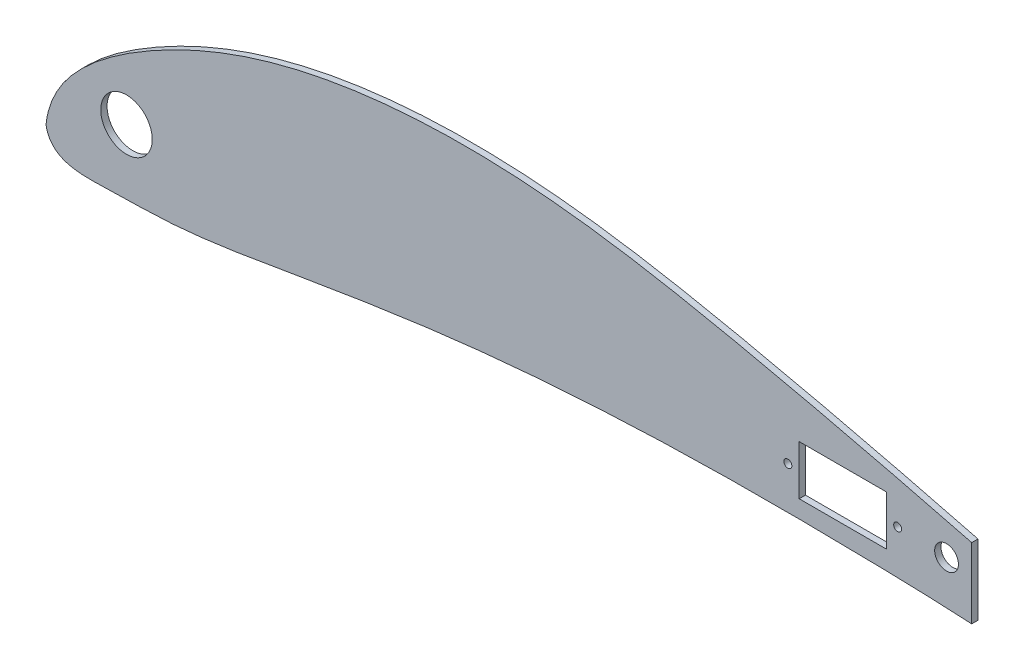
ISO-10303-21;
HEADER;
FILE_DESCRIPTION(('STEP AP214'),'2;1');
FILE_NAME('part.step','',(''),(''),'','','');
FILE_SCHEMA(('AUTOMOTIVE_DESIGN { 1 0 10303 214 1 1 1 1 }'));
ENDSEC;
DATA;
#1=APPLICATION_CONTEXT('core data for automotive mechanical design processes');
#2=APPLICATION_PROTOCOL_DEFINITION('international standard','automotive_design',2000,#1);
#3=PRODUCT_CONTEXT('',#1,'mechanical');
#4=PRODUCT('Part','Part','',(#3));
#5=PRODUCT_RELATED_PRODUCT_CATEGORY('part','',(#4));
#6=PRODUCT_DEFINITION_FORMATION('','',#4);
#7=PRODUCT_DEFINITION_CONTEXT('part definition',#1,'design');
#8=PRODUCT_DEFINITION('design','',#6,#7);
#9=PRODUCT_DEFINITION_SHAPE('','',#8);
#10=(LENGTH_UNIT() NAMED_UNIT(*) SI_UNIT(.MILLI.,.METRE.));
#11=(NAMED_UNIT(*) PLANE_ANGLE_UNIT() SI_UNIT($,.RADIAN.));
#12=(NAMED_UNIT(*) SI_UNIT($,.STERADIAN.) SOLID_ANGLE_UNIT());
#13=UNCERTAINTY_MEASURE_WITH_UNIT(LENGTH_MEASURE(1.E-05),#10,'distance_accuracy_value','');
#14=(GEOMETRIC_REPRESENTATION_CONTEXT(3) GLOBAL_UNCERTAINTY_ASSIGNED_CONTEXT((#13)) GLOBAL_UNIT_ASSIGNED_CONTEXT((#10,
#11,#12)) REPRESENTATION_CONTEXT('',''));
#15=CARTESIAN_POINT('',(0.,0.,0.));
#16=DIRECTION('',(0.,0.,1.));
#17=DIRECTION('',(1.,0.,0.));
#18=AXIS2_PLACEMENT_3D('',#15,#16,#17);
#19=CARTESIAN_POINT('',(0.000560351162113587,0.000130087070423624,1.5875));
#20=CARTESIAN_POINT('',(1.23071418869678,-6.92407609127206,1.5875));
#21=CARTESIAN_POINT('',(15.3166033306834,-6.18906584099094,1.5875));
#22=CARTESIAN_POINT('',(36.4546728163185,-6.09849990105009,1.5875));
#23=CARTESIAN_POINT('',(66.5061971849192,-0.586669106973501,1.5875));
#24=CARTESIAN_POINT('',(110.497331171581,6.18149522271792,1.5875));
#25=CARTESIAN_POINT('',(157.718638091679,9.03065014873911,1.5875));
#26=CARTESIAN_POINT('',(205.10142463584,8.83808028186313,1.5875));
#27=CARTESIAN_POINT('',(235.858814759408,7.87030619247826,1.5875));
#28=CARTESIAN_POINT('',(260.846344817159,5.42741339404395,1.5875));
#29=CARTESIAN_POINT('',(276.264022989737,4.51435670375389,1.5875));
#30=CARTESIAN_POINT('',(293.989507544058,2.09398731346533,1.5875));
#31=CARTESIAN_POINT('',(303.956832564589,1.47095520994628,1.5875));
#32=CARTESIAN_POINT('',(309.846313894505,0.000130087070423666,1.5875));
#33=B_SPLINE_CURVE_WITH_KNOTS('',3,(#19,#20,#21,#22,#23,#24,#25,#26,#27,#28,#29,#30,#31,#32),
.UNSPECIFIED.,.F.,.F.,(4,1,1,1,1,1,1,1,1,1,1,4),(0.,0.0569078595717698,0.106482711504673,
0.214488052979465,0.341297688349143,0.535095665520157,0.664680853556909,0.794660698192775,
0.828978881532905,0.904725108725214,0.942212919019968,1.),.UNSPECIFIED.);
#34=DIRECTION('',(0.,0.,-1.));
#35=VECTOR('',#34,1.);
#36=SURFACE_OF_LINEAR_EXTRUSION('',#33,#35);
#37=DIRECTION('',(0.,0.,-1.));
#38=VECTOR('',#37,1.);
#39=CARTESIAN_POINT('',(233.646313894505,7.69052977092525,1.5875));
#40=LINE('',#39,#38);
#41=CARTESIAN_POINT('',(233.646313894505,7.69052977146896,1.5875));
#42=VERTEX_POINT('',#41);
#43=CARTESIAN_POINT('',(233.646313884782,7.69052977146896,0.));
#44=VERTEX_POINT('',#43);
#45=EDGE_CURVE('E160',#42,#44,#40,.T.);
#46=ORIENTED_EDGE('',*,*,#45,.F.);
#47=CARTESIAN_POINT('',(0.000560351162116727,0.000130087070423829,1.5875));
#48=VERTEX_POINT('',#47);
#49=EDGE_CURVE('E179',#48,#42,#33,.T.);
#50=ORIENTED_EDGE('',*,*,#49,.F.);
#51=DIRECTION('',(0.,0.,-1.));
#52=VECTOR('',#51,1.);
#53=CARTESIAN_POINT('',(0.000560351162116727,0.000130087070423829,1.5875));
#54=LINE('',#53,#52);
#55=CARTESIAN_POINT('',(0.000560351162116727,0.000130087070423829,0.));
#56=VERTEX_POINT('',#55);
#57=EDGE_CURVE('E50',#48,#56,#54,.T.);
#58=ORIENTED_EDGE('',*,*,#57,.T.);
#59=CARTESIAN_POINT('',(0.000560351162113587,0.000130087070423624,0.));
#60=CARTESIAN_POINT('',(1.23071418869678,-6.92407609127206,0.));
#61=CARTESIAN_POINT('',(15.3166033306834,-6.18906584099094,0.));
#62=CARTESIAN_POINT('',(36.4546728163185,-6.09849990105009,0.));
#63=CARTESIAN_POINT('',(66.5061971849192,-0.586669106973501,0.));
#64=CARTESIAN_POINT('',(110.497331171581,6.18149522271792,0.));
#65=CARTESIAN_POINT('',(157.718638091679,9.03065014873911,0.));
#66=CARTESIAN_POINT('',(205.10142463584,8.83808028186313,0.));
#67=CARTESIAN_POINT('',(235.858814759408,7.87030619247826,0.));
#68=CARTESIAN_POINT('',(260.846344817159,5.42741339404395,0.));
#69=CARTESIAN_POINT('',(276.264022989737,4.51435670375389,0.));
#70=CARTESIAN_POINT('',(293.989507544058,2.09398731346533,0.));
#71=CARTESIAN_POINT('',(303.956832564589,1.47095520994628,0.));
#72=CARTESIAN_POINT('',(309.846313894505,0.000130087070423666,0.));
#73=B_SPLINE_CURVE_WITH_KNOTS('',3,(#59,#60,#61,#62,#63,#64,#65,#66,#67,#68,#69,#70,#71,#72),
.UNSPECIFIED.,.F.,.F.,(4,1,1,1,1,1,1,1,1,1,1,4),(0.,0.0569078595717698,0.106482711504673,
0.214488052979465,0.341297688349143,0.535095665520157,0.664680853556909,0.794660698192775,
0.828978881532905,0.904725108725214,0.942212919019968,1.),.UNSPECIFIED.);
#74=EDGE_CURVE('E168',#56,#44,#73,.T.);
#75=ORIENTED_EDGE('',*,*,#74,.T.);
#76=EDGE_LOOP('',(#46,#50,#58,#75));
#77=FACE_BOUND('',#76,.T.);
#78=ADVANCED_FACE('F41',(#77),#36,.F.);
#79=CARTESIAN_POINT('',(309.846313894505,0.000130087070423864,1.5875));
#80=CARTESIAN_POINT('',(314.816918223261,-0.51620674157964,1.5875));
#81=CARTESIAN_POINT('',(301.273197720551,4.38282813873556,1.5875));
#82=CARTESIAN_POINT('',(290.359837670022,8.71099439045776,1.5875));
#83=CARTESIAN_POINT('',(256.952064400645,19.5289209482833,1.5875));
#84=CARTESIAN_POINT('',(217.961060472083,29.6129748944238,1.5875));
#85=CARTESIAN_POINT('',(173.256699242147,40.0411042779434,1.5875));
#86=CARTESIAN_POINT('',(131.400792108858,47.8848319151037,1.5875));
#87=CARTESIAN_POINT('',(89.5976184754884,49.290763053775,1.5875));
#88=CARTESIAN_POINT('',(52.1111282710831,42.0692152748914,1.5875));
#89=CARTESIAN_POINT('',(26.2867198183782,29.9751763284633,1.5875));
#90=CARTESIAN_POINT('',(8.64909202481883,17.8566051741579,1.5875));
#91=CARTESIAN_POINT('',(0.810633126632263,7.35919605469637,1.5875));
#92=CARTESIAN_POINT('',(0.000560351162116727,0.000130087070423829,1.5875));
#93=B_SPLINE_CURVE_WITH_KNOTS('',3,(#79,#80,#81,#82,#83,#84,#85,#86,#87,#88,#89,#90,#91,#92),
.UNSPECIFIED.,.F.,.F.,(4,1,1,1,1,1,1,1,1,1,1,4),(0.,0.0239417713693992,0.070244030177139,
0.147561721425381,0.308455887006792,0.442387865106874,0.551517565626309,0.687091076796298,
0.811391258419108,0.886311735305172,0.939136382225768,1.),.UNSPECIFIED.);
#94=DIRECTION('',(0.,0.,-1.));
#95=VECTOR('',#94,1.);
#96=SURFACE_OF_LINEAR_EXTRUSION('',#93,#95);
#97=DIRECTION('',(0.,0.,-1.));
#98=VECTOR('',#97,1.);
#99=CARTESIAN_POINT('',(233.646313894505,25.4527523940641,1.5875));
#100=LINE('',#99,#98);
#101=CARTESIAN_POINT('',(233.646313894505,25.4527523915985,0.));
#102=VERTEX_POINT('',#101);
#103=CARTESIAN_POINT('',(233.646313894505,25.4527523915985,1.5875));
#104=VERTEX_POINT('',#103);
#105=EDGE_CURVE('E157',#102,#104,#100,.F.);
#106=ORIENTED_EDGE('',*,*,#105,.F.);
#107=CARTESIAN_POINT('',(309.846313894505,0.000130087070423864,0.));
#108=CARTESIAN_POINT('',(314.816918223261,-0.51620674157964,0.));
#109=CARTESIAN_POINT('',(301.273197720551,4.38282813873556,0.));
#110=CARTESIAN_POINT('',(290.359837670022,8.71099439045776,0.));
#111=CARTESIAN_POINT('',(256.952064400645,19.5289209482833,0.));
#112=CARTESIAN_POINT('',(217.961060472083,29.6129748944238,0.));
#113=CARTESIAN_POINT('',(173.256699242147,40.0411042779434,0.));
#114=CARTESIAN_POINT('',(131.400792108858,47.8848319151037,0.));
#115=CARTESIAN_POINT('',(89.5976184754884,49.290763053775,0.));
#116=CARTESIAN_POINT('',(52.1111282710831,42.0692152748914,0.));
#117=CARTESIAN_POINT('',(26.2867198183782,29.9751763284633,0.));
#118=CARTESIAN_POINT('',(8.64909202481883,17.8566051741579,0.));
#119=CARTESIAN_POINT('',(0.810633126632263,7.35919605469637,0.));
#120=CARTESIAN_POINT('',(0.000560351162116727,0.000130087070423829,0.));
#121=B_SPLINE_CURVE_WITH_KNOTS('',3,(#107,#108,#109,#110,#111,#112,#113,#114,#115,#116,#117,
#118,#119,#120),.UNSPECIFIED.,.F.,.F.,(4,1,1,1,1,1,1,1,1,1,1,4),(0.,0.0239417713693992,
0.070244030177139,0.147561721425381,0.308455887006792,0.442387865106874,0.551517565626309,
0.687091076796298,0.811391258419108,0.886311735305172,0.939136382225768,1.),.UNSPECIFIED.);
#122=EDGE_CURVE('E187',#102,#56,#121,.T.);
#123=ORIENTED_EDGE('',*,*,#122,.T.);
#124=ORIENTED_EDGE('',*,*,#57,.F.);
#125=EDGE_CURVE('E186',#104,#48,#93,.T.);
#126=ORIENTED_EDGE('',*,*,#125,.F.);
#127=EDGE_LOOP('',(#106,#123,#124,#126));
#128=FACE_BOUND('',#127,.T.);
#129=ADVANCED_FACE('F202',(#128),#96,.F.);
#130=CARTESIAN_POINT('',(153.387816973495,8.33338198857885,1.5875));
#131=DIRECTION('',(0.,0.,-1.));
#132=DIRECTION('',(-1.,0.,0.));
#133=AXIS2_PLACEMENT_3D('',#130,#131,#132);
#134=PLANE('',#133);
#135=CARTESIAN_POINT('',(187.249245332241,19.5180922777156,1.5875));
#136=DIRECTION('',(0.,0.,1.));
#137=DIRECTION('',(1.,0.,0.));
#138=AXIS2_PLACEMENT_3D('',#135,#136,#137);
#139=CIRCLE('',#138,1.00076);
#140=CARTESIAN_POINT('',(188.250005332241,19.5180922777156,1.5875));
#141=VERTEX_POINT('',#140);
#142=EDGE_CURVE('E129',#141,#141,#139,.T.);
#143=ORIENTED_EDGE('',*,*,#142,.F.);
#144=EDGE_LOOP('',(#143));
#145=FACE_BOUND('',#144,.T.);
#146=CARTESIAN_POINT('',(214.949245332241,19.5180922777156,1.5875));
#147=DIRECTION('',(0.,0.,1.));
#148=DIRECTION('',(1.,0.,0.));
#149=AXIS2_PLACEMENT_3D('',#146,#147,#148);
#150=CIRCLE('',#149,1.00076);
#151=CARTESIAN_POINT('',(215.950005332241,19.5180922777156,1.5875));
#152=VERTEX_POINT('',#151);
#153=EDGE_CURVE('E347',#152,#152,#150,.T.);
#154=ORIENTED_EDGE('',*,*,#153,.F.);
#155=EDGE_LOOP('',(#154));
#156=FACE_BOUND('',#155,.T.);
#157=DIRECTION('',(1.,0.,0.));
#158=VECTOR('',#157,1.);
#159=CARTESIAN_POINT('',(190.099245332241,13.2680922777156,1.5875));
#160=LINE('',#159,#158);
#161=CARTESIAN_POINT('',(190.099245332241,13.2680922777156,1.5875));
#162=VERTEX_POINT('',#161);
#163=CARTESIAN_POINT('',(212.099245332241,13.2680922777156,1.5875));
#164=VERTEX_POINT('',#163);
#165=EDGE_CURVE('E138',#162,#164,#160,.T.);
#166=ORIENTED_EDGE('',*,*,#165,.F.);
#167=DIRECTION('',(0.,-1.,0.));
#168=VECTOR('',#167,1.);
#169=CARTESIAN_POINT('',(190.099245332241,25.7680922777156,1.5875));
#170=LINE('',#169,#168);
#171=CARTESIAN_POINT('',(190.099245332241,25.7680922777156,1.5875));
#172=VERTEX_POINT('',#171);
#173=EDGE_CURVE('E57',#172,#162,#170,.T.);
#174=ORIENTED_EDGE('',*,*,#173,.F.);
#175=DIRECTION('',(-1.,0.,0.));
#176=VECTOR('',#175,1.);
#177=CARTESIAN_POINT('',(190.099245332241,25.7680922777156,1.5875));
#178=LINE('',#177,#176);
#179=CARTESIAN_POINT('',(212.099245332241,25.7680922777156,1.5875));
#180=VERTEX_POINT('',#179);
#181=EDGE_CURVE('E122',#180,#172,#178,.T.);
#182=ORIENTED_EDGE('',*,*,#181,.F.);
#183=DIRECTION('',(0.,1.,0.));
#184=VECTOR('',#183,1.);
#185=CARTESIAN_POINT('',(212.099245332241,25.7680922777156,1.5875));
#186=LINE('',#185,#184);
#187=EDGE_CURVE('E126',#164,#180,#186,.T.);
#188=ORIENTED_EDGE('',*,*,#187,.F.);
#189=EDGE_LOOP('',(#166,#174,#182,#188));
#190=FACE_BOUND('',#189,.T.);
#191=CARTESIAN_POINT('',(227.296313894505,19.0501300870704,1.5875));
#192=DIRECTION('',(0.,0.,1.));
#193=DIRECTION('',(1.,0.,0.));
#194=AXIS2_PLACEMENT_3D('',#191,#192,#193);
#195=CIRCLE('',#194,2.99999999999999);
#196=CARTESIAN_POINT('',(230.296313894505,19.0501300870704,1.5875));
#197=VERTEX_POINT('',#196);
#198=EDGE_CURVE('E163',#197,#197,#195,.T.);
#199=ORIENTED_EDGE('',*,*,#198,.F.);
#200=EDGE_LOOP('',(#199));
#201=FACE_BOUND('',#200,.T.);
#202=CARTESIAN_POINT('',(20.32,10.16,1.5875));
#203=DIRECTION('',(0.,0.,1.));
#204=DIRECTION('',(1.,0.,0.));
#205=AXIS2_PLACEMENT_3D('',#202,#203,#204);
#206=CIRCLE('',#205,6.5);
#207=CARTESIAN_POINT('',(26.82,10.16,1.5875));
#208=VERTEX_POINT('',#207);
#209=EDGE_CURVE('E169',#208,#208,#206,.T.);
#210=ORIENTED_EDGE('',*,*,#209,.F.);
#211=EDGE_LOOP('',(#210));
#212=FACE_BOUND('',#211,.T.);
#213=DIRECTION('',(0.,1.,0.));
#214=VECTOR('',#213,1.);
#215=CARTESIAN_POINT('',(233.646313894505,-6.34986991292955,1.5875));
#216=LINE('',#215,#214);
#217=EDGE_CURVE('E148',#42,#104,#216,.T.);
#218=ORIENTED_EDGE('',*,*,#217,.T.);
#219=ORIENTED_EDGE('',*,*,#125,.T.);
#220=ORIENTED_EDGE('',*,*,#49,.T.);
#221=EDGE_LOOP('',(#218,#219,#220));
#222=FACE_BOUND('',#221,.T.);
#223=ADVANCED_FACE('F205',(#145,#156,#190,#201,#212,#222),#134,.F.);
#224=CARTESIAN_POINT('',(153.387816973495,8.33338198857885,0.));
#225=DIRECTION('',(0.,0.,-1.));
#226=DIRECTION('',(-1.,0.,0.));
#227=AXIS2_PLACEMENT_3D('',#224,#225,#226);
#228=PLANE('',#227);
#229=CARTESIAN_POINT('',(187.249245332241,19.5180922777156,0.));
#230=DIRECTION('',(0.,0.,1.));
#231=DIRECTION('',(1.,0.,0.));
#232=AXIS2_PLACEMENT_3D('',#229,#230,#231);
#233=CIRCLE('',#232,1.00076);
#234=CARTESIAN_POINT('',(188.250005332241,19.5180922777156,0.));
#235=VERTEX_POINT('',#234);
#236=EDGE_CURVE('E350',#235,#235,#233,.T.);
#237=ORIENTED_EDGE('',*,*,#236,.T.);
#238=EDGE_LOOP('',(#237));
#239=FACE_BOUND('',#238,.T.);
#240=CARTESIAN_POINT('',(214.949245332241,19.5180922777156,0.));
#241=DIRECTION('',(0.,0.,1.));
#242=DIRECTION('',(1.,0.,0.));
#243=AXIS2_PLACEMENT_3D('',#240,#241,#242);
#244=CIRCLE('',#243,1.00076);
#245=CARTESIAN_POINT('',(215.950005332241,19.5180922777156,0.));
#246=VERTEX_POINT('',#245);
#247=EDGE_CURVE('E139',#246,#246,#244,.T.);
#248=ORIENTED_EDGE('',*,*,#247,.T.);
#249=EDGE_LOOP('',(#248));
#250=FACE_BOUND('',#249,.T.);
#251=DIRECTION('',(0.,-1.,0.));
#252=VECTOR('',#251,1.);
#253=CARTESIAN_POINT('',(190.099245332241,25.7680922777156,0.));
#254=LINE('',#253,#252);
#255=CARTESIAN_POINT('',(190.099245332241,25.7680922777156,0.));
#256=VERTEX_POINT('',#255);
#257=CARTESIAN_POINT('',(190.099245332241,13.2680922777156,0.));
#258=VERTEX_POINT('',#257);
#259=EDGE_CURVE('E103',#256,#258,#254,.T.);
#260=ORIENTED_EDGE('',*,*,#259,.T.);
#261=DIRECTION('',(1.,0.,0.));
#262=VECTOR('',#261,1.);
#263=CARTESIAN_POINT('',(190.099245332241,13.2680922777156,0.));
#264=LINE('',#263,#262);
#265=CARTESIAN_POINT('',(212.099245332241,13.2680922777156,0.));
#266=VERTEX_POINT('',#265);
#267=EDGE_CURVE('E113',#258,#266,#264,.T.);
#268=ORIENTED_EDGE('',*,*,#267,.T.);
#269=DIRECTION('',(0.,1.,0.));
#270=VECTOR('',#269,1.);
#271=CARTESIAN_POINT('',(212.099245332241,25.7680922777156,0.));
#272=LINE('',#271,#270);
#273=CARTESIAN_POINT('',(212.099245332241,25.7680922777156,0.));
#274=VERTEX_POINT('',#273);
#275=EDGE_CURVE('E65',#266,#274,#272,.T.);
#276=ORIENTED_EDGE('',*,*,#275,.T.);
#277=DIRECTION('',(-1.,0.,0.));
#278=VECTOR('',#277,1.);
#279=CARTESIAN_POINT('',(190.099245332241,25.7680922777156,0.));
#280=LINE('',#279,#278);
#281=EDGE_CURVE('E110',#274,#256,#280,.T.);
#282=ORIENTED_EDGE('',*,*,#281,.T.);
#283=EDGE_LOOP('',(#260,#268,#276,#282));
#284=FACE_BOUND('',#283,.T.);
#285=CARTESIAN_POINT('',(20.32,10.16,0.));
#286=DIRECTION('',(0.,0.,1.));
#287=DIRECTION('',(1.,0.,0.));
#288=AXIS2_PLACEMENT_3D('',#285,#286,#287);
#289=CIRCLE('',#288,6.5);
#290=CARTESIAN_POINT('',(26.82,10.16,0.));
#291=VERTEX_POINT('',#290);
#292=EDGE_CURVE('E164',#291,#291,#289,.T.);
#293=ORIENTED_EDGE('',*,*,#292,.T.);
#294=EDGE_LOOP('',(#293));
#295=FACE_BOUND('',#294,.T.);
#296=CARTESIAN_POINT('',(227.296313894505,19.0501300870704,0.));
#297=DIRECTION('',(0.,0.,1.));
#298=DIRECTION('',(1.,0.,0.));
#299=AXIS2_PLACEMENT_3D('',#296,#297,#298);
#300=CIRCLE('',#299,2.99999999999999);
#301=CARTESIAN_POINT('',(230.296313894505,19.0501300870704,0.));
#302=VERTEX_POINT('',#301);
#303=EDGE_CURVE('E173',#302,#302,#300,.T.);
#304=ORIENTED_EDGE('',*,*,#303,.T.);
#305=EDGE_LOOP('',(#304));
#306=FACE_BOUND('',#305,.T.);
#307=ORIENTED_EDGE('',*,*,#122,.F.);
#308=DIRECTION('',(0.,-1.,0.));
#309=VECTOR('',#308,1.);
#310=CARTESIAN_POINT('',(233.646313894505,8.33338198857885,0.));
#311=LINE('',#310,#309);
#312=EDGE_CURVE('E11',#102,#44,#311,.T.);
#313=ORIENTED_EDGE('',*,*,#312,.T.);
#314=ORIENTED_EDGE('',*,*,#74,.F.);
#315=EDGE_LOOP('',(#307,#313,#314));
#316=FACE_BOUND('',#315,.T.);
#317=ADVANCED_FACE('F118',(#239,#250,#284,#295,#306,#316),#228,.T.);
#318=CARTESIAN_POINT('',(227.296313894505,19.0501300870704,0.));
#319=DIRECTION('',(0.,0.,1.));
#320=DIRECTION('',(1.,0.,0.));
#321=AXIS2_PLACEMENT_3D('',#318,#319,#320);
#322=CYLINDRICAL_SURFACE('',#321,2.99999999999999);
#323=ORIENTED_EDGE('',*,*,#303,.F.);
#324=EDGE_LOOP('',(#323));
#325=FACE_BOUND('',#324,.T.);
#326=ORIENTED_EDGE('',*,*,#198,.T.);
#327=EDGE_LOOP('',(#326));
#328=FACE_BOUND('',#327,.T.);
#329=ADVANCED_FACE('F209',(#325,#328),#322,.F.);
#330=CARTESIAN_POINT('',(20.32,10.16,0.));
#331=DIRECTION('',(0.,0.,1.));
#332=DIRECTION('',(1.,0.,0.));
#333=AXIS2_PLACEMENT_3D('',#330,#331,#332);
#334=CYLINDRICAL_SURFACE('',#333,6.5);
#335=ORIENTED_EDGE('',*,*,#292,.F.);
#336=EDGE_LOOP('',(#335));
#337=FACE_BOUND('',#336,.T.);
#338=ORIENTED_EDGE('',*,*,#209,.T.);
#339=EDGE_LOOP('',(#338));
#340=FACE_BOUND('',#339,.T.);
#341=ADVANCED_FACE('F216',(#337,#340),#334,.F.);
#342=CARTESIAN_POINT('',(233.646313894505,-6.34986991292955,0.));
#343=DIRECTION('',(1.,0.,0.));
#344=DIRECTION('',(0.,0.,-1.));
#345=AXIS2_PLACEMENT_3D('',#342,#343,#344);
#346=PLANE('',#345);
#347=ORIENTED_EDGE('',*,*,#45,.T.);
#348=ORIENTED_EDGE('',*,*,#312,.F.);
#349=ORIENTED_EDGE('',*,*,#105,.T.);
#350=ORIENTED_EDGE('',*,*,#217,.F.);
#351=EDGE_LOOP('',(#347,#348,#349,#350));
#352=FACE_BOUND('',#351,.T.);
#353=ADVANCED_FACE('F220',(#352),#346,.T.);
#354=CARTESIAN_POINT('',(190.099245332241,25.7680922777156,0.));
#355=DIRECTION('',(-1.,0.,0.));
#356=DIRECTION('',(0.,0.,1.));
#357=AXIS2_PLACEMENT_3D('',#354,#355,#356);
#358=PLANE('',#357);
#359=ORIENTED_EDGE('',*,*,#173,.T.);
#360=DIRECTION('',(0.,0.,1.));
#361=VECTOR('',#360,1.);
#362=CARTESIAN_POINT('',(190.099245332241,13.2680922777156,0.));
#363=LINE('',#362,#361);
#364=EDGE_CURVE('E99',#258,#162,#363,.T.);
#365=ORIENTED_EDGE('',*,*,#364,.F.);
#366=ORIENTED_EDGE('',*,*,#259,.F.);
#367=DIRECTION('',(0.,0.,1.));
#368=VECTOR('',#367,1.);
#369=CARTESIAN_POINT('',(190.099245332241,25.7680922777156,0.));
#370=LINE('',#369,#368);
#371=EDGE_CURVE('E145',#256,#172,#370,.T.);
#372=ORIENTED_EDGE('',*,*,#371,.T.);
#373=EDGE_LOOP('',(#359,#365,#366,#372));
#374=FACE_BOUND('',#373,.T.);
#375=ADVANCED_FACE('F101',(#374),#358,.F.);
#376=CARTESIAN_POINT('',(190.099245332241,25.7680922777156,0.));
#377=DIRECTION('',(0.,1.,0.));
#378=DIRECTION('',(0.,0.,1.));
#379=AXIS2_PLACEMENT_3D('',#376,#377,#378);
#380=PLANE('',#379);
#381=ORIENTED_EDGE('',*,*,#181,.T.);
#382=ORIENTED_EDGE('',*,*,#371,.F.);
#383=ORIENTED_EDGE('',*,*,#281,.F.);
#384=DIRECTION('',(0.,0.,1.));
#385=VECTOR('',#384,1.);
#386=CARTESIAN_POINT('',(212.099245332241,25.7680922777156,0.));
#387=LINE('',#386,#385);
#388=EDGE_CURVE('E149',#274,#180,#387,.T.);
#389=ORIENTED_EDGE('',*,*,#388,.T.);
#390=EDGE_LOOP('',(#381,#382,#383,#389));
#391=FACE_BOUND('',#390,.T.);
#392=ADVANCED_FACE('F227',(#391),#380,.F.);
#393=CARTESIAN_POINT('',(212.099245332241,25.7680922777156,0.));
#394=DIRECTION('',(1.,0.,0.));
#395=DIRECTION('',(0.,0.,-1.));
#396=AXIS2_PLACEMENT_3D('',#393,#394,#395);
#397=PLANE('',#396);
#398=ORIENTED_EDGE('',*,*,#187,.T.);
#399=ORIENTED_EDGE('',*,*,#388,.F.);
#400=ORIENTED_EDGE('',*,*,#275,.F.);
#401=DIRECTION('',(0.,0.,1.));
#402=VECTOR('',#401,1.);
#403=CARTESIAN_POINT('',(212.099245332241,13.2680922777156,0.));
#404=LINE('',#403,#402);
#405=EDGE_CURVE('E109',#266,#164,#404,.T.);
#406=ORIENTED_EDGE('',*,*,#405,.T.);
#407=EDGE_LOOP('',(#398,#399,#400,#406));
#408=FACE_BOUND('',#407,.T.);
#409=ADVANCED_FACE('F231',(#408),#397,.F.);
#410=CARTESIAN_POINT('',(190.099245332241,13.2680922777156,0.));
#411=DIRECTION('',(0.,-1.,0.));
#412=DIRECTION('',(1.,0.,0.));
#413=AXIS2_PLACEMENT_3D('',#410,#411,#412);
#414=PLANE('',#413);
#415=ORIENTED_EDGE('',*,*,#165,.T.);
#416=ORIENTED_EDGE('',*,*,#405,.F.);
#417=ORIENTED_EDGE('',*,*,#267,.F.);
#418=ORIENTED_EDGE('',*,*,#364,.T.);
#419=EDGE_LOOP('',(#415,#416,#417,#418));
#420=FACE_BOUND('',#419,.T.);
#421=ADVANCED_FACE('F114',(#420),#414,.F.);
#422=CARTESIAN_POINT('',(214.949245332241,19.5180922777156,0.));
#423=DIRECTION('',(0.,0.,1.));
#424=DIRECTION('',(1.,0.,0.));
#425=AXIS2_PLACEMENT_3D('',#422,#423,#424);
#426=CYLINDRICAL_SURFACE('',#425,1.00076);
#427=ORIENTED_EDGE('',*,*,#247,.F.);
#428=EDGE_LOOP('',(#427));
#429=FACE_BOUND('',#428,.T.);
#430=ORIENTED_EDGE('',*,*,#153,.T.);
#431=EDGE_LOOP('',(#430));
#432=FACE_BOUND('',#431,.T.);
#433=ADVANCED_FACE('F230',(#429,#432),#426,.F.);
#434=CARTESIAN_POINT('',(187.249245332241,19.5180922777156,0.));
#435=DIRECTION('',(0.,0.,1.));
#436=DIRECTION('',(1.,0.,0.));
#437=AXIS2_PLACEMENT_3D('',#434,#435,#436);
#438=CYLINDRICAL_SURFACE('',#437,1.00076);
#439=ORIENTED_EDGE('',*,*,#236,.F.);
#440=EDGE_LOOP('',(#439));
#441=FACE_BOUND('',#440,.T.);
#442=ORIENTED_EDGE('',*,*,#142,.T.);
#443=EDGE_LOOP('',(#442));
#444=FACE_BOUND('',#443,.T.);
#445=ADVANCED_FACE('F237',(#441,#444),#438,.F.);
#446=CLOSED_SHELL('',(#78,#129,#223,#317,#329,#341,#353,#375,#392,#409,#421,#433,#445));
#447=MANIFOLD_SOLID_BREP('B2',#446);
#448=ADVANCED_BREP_SHAPE_REPRESENTATION('',(#18,#447),#14);
#449=SHAPE_DEFINITION_REPRESENTATION(#9,#448);
ENDSEC;
END-ISO-10303-21;
